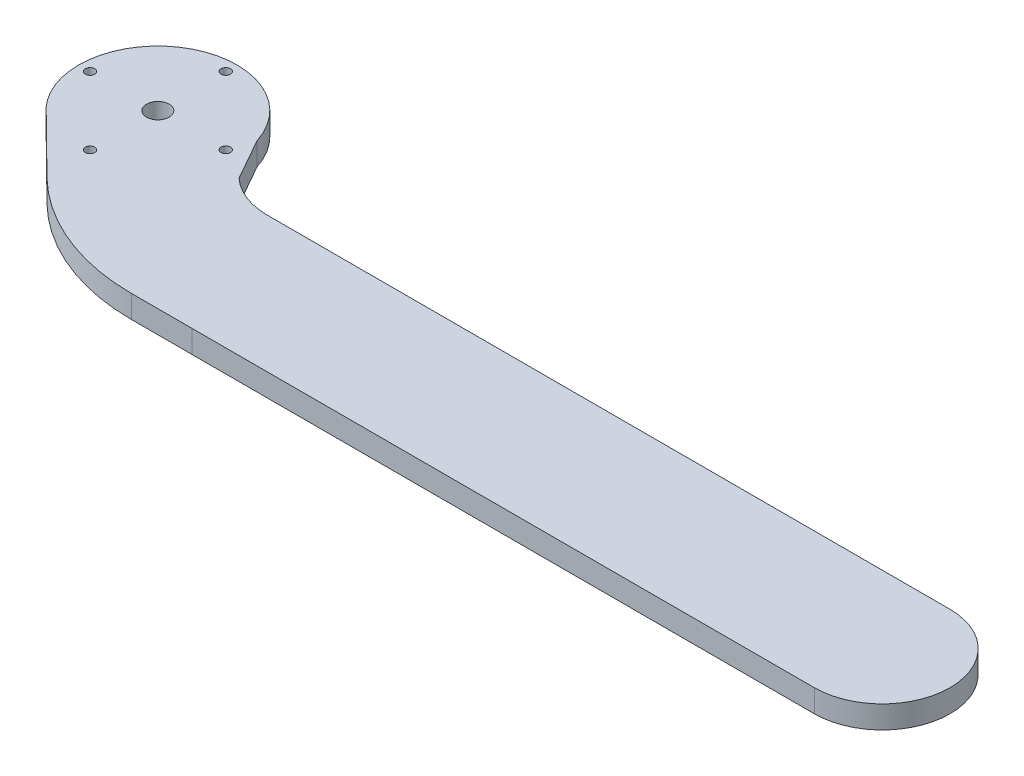
ISO-10303-21;
HEADER;
FILE_DESCRIPTION(('STEP AP214'),'2;1');
FILE_NAME('part.step','',(''),(''),'','','');
FILE_SCHEMA(('AUTOMOTIVE_DESIGN { 1 0 10303 214 1 1 1 1 }'));
ENDSEC;
DATA;
#1=APPLICATION_CONTEXT('core data for automotive mechanical design processes');
#2=APPLICATION_PROTOCOL_DEFINITION('international standard','automotive_design',2000,#1);
#3=PRODUCT_CONTEXT('',#1,'mechanical');
#4=PRODUCT('Part','Part','',(#3));
#5=PRODUCT_RELATED_PRODUCT_CATEGORY('part','',(#4));
#6=PRODUCT_DEFINITION_FORMATION('','',#4);
#7=PRODUCT_DEFINITION_CONTEXT('part definition',#1,'design');
#8=PRODUCT_DEFINITION('design','',#6,#7);
#9=PRODUCT_DEFINITION_SHAPE('','',#8);
#10=(LENGTH_UNIT() NAMED_UNIT(*) SI_UNIT(.MILLI.,.METRE.));
#11=(NAMED_UNIT(*) PLANE_ANGLE_UNIT() SI_UNIT($,.RADIAN.));
#12=(NAMED_UNIT(*) SI_UNIT($,.STERADIAN.) SOLID_ANGLE_UNIT());
#13=UNCERTAINTY_MEASURE_WITH_UNIT(LENGTH_MEASURE(1.E-05),#10,'distance_accuracy_value','');
#14=(GEOMETRIC_REPRESENTATION_CONTEXT(3) GLOBAL_UNCERTAINTY_ASSIGNED_CONTEXT((#13)) GLOBAL_UNIT_ASSIGNED_CONTEXT((#10,
#11,#12)) REPRESENTATION_CONTEXT('',''));
#15=CARTESIAN_POINT('',(0.,0.,0.));
#16=DIRECTION('',(0.,0.,1.));
#17=DIRECTION('',(1.,0.,0.));
#18=AXIS2_PLACEMENT_3D('',#15,#16,#17);
#19=CARTESIAN_POINT('',(-216.674785410447,10.,-94.1628705313177));
#20=DIRECTION('',(-0.000223300198745753,0.,-0.99999997506851));
#21=DIRECTION('',(-0.99999997506851,0.,0.000223300198745753));
#22=AXIS2_PLACEMENT_3D('',#19,#20,#21);
#23=PLANE('',#22);
#24=DIRECTION('',(0.99999997506851,0.,-0.000223300198745753));
#25=VECTOR('',#24,1.);
#26=CARTESIAN_POINT('',(-216.674785410447,0.,-94.1628705313177));
#27=LINE('',#26,#25);
#28=CARTESIAN_POINT('',(-224.228087349179,0.,-94.1611838774515));
#29=VERTEX_POINT('',#28);
#30=CARTESIAN_POINT('',(-216.674785410447,0.,-94.1628705313177));
#31=VERTEX_POINT('',#30);
#32=EDGE_CURVE('E149',#29,#31,#27,.T.);
#33=ORIENTED_EDGE('',*,*,#32,.T.);
#34=DIRECTION('',(0.,-1.,0.));
#35=VECTOR('',#34,1.);
#36=CARTESIAN_POINT('',(-216.674785410447,10.,-94.1628705313177));
#37=LINE('',#36,#35);
#38=CARTESIAN_POINT('',(-216.674785410447,10.,-94.1628705313177));
#39=VERTEX_POINT('',#38);
#40=EDGE_CURVE('E11',#39,#31,#37,.T.);
#41=ORIENTED_EDGE('',*,*,#40,.F.);
#42=DIRECTION('',(0.99999997506851,0.,-0.000223300198745753));
#43=VECTOR('',#42,1.);
#44=CARTESIAN_POINT('',(-216.674785410447,10.,-94.1628705313177));
#45=LINE('',#44,#43);
#46=CARTESIAN_POINT('',(-224.228087349179,10.,-94.1611838774515));
#47=VERTEX_POINT('',#46);
#48=EDGE_CURVE('E168',#47,#39,#45,.T.);
#49=ORIENTED_EDGE('',*,*,#48,.F.);
#50=DIRECTION('',(0.,-1.,0.));
#51=VECTOR('',#50,1.);
#52=CARTESIAN_POINT('',(-224.228087349179,10.,-94.1611838774515));
#53=LINE('',#52,#51);
#54=EDGE_CURVE('E145',#47,#29,#53,.T.);
#55=ORIENTED_EDGE('',*,*,#54,.T.);
#56=EDGE_LOOP('',(#33,#41,#49,#55));
#57=FACE_BOUND('',#56,.T.);
#58=ADVANCED_FACE('F41',(#57),#23,.F.);
#59=CARTESIAN_POINT('',(-216.672908110656,10.,-124.162870472581));
#60=DIRECTION('',(0.,-1.,0.));
#61=DIRECTION('',(0.,0.,-1.));
#62=AXIS2_PLACEMENT_3D('',#59,#60,#61);
#63=CYLINDRICAL_SURFACE('',#62,30.0000000000009);
#64=CARTESIAN_POINT('',(-216.672908110656,0.,-124.162870472581));
#65=DIRECTION('',(0.,-1.,0.));
#66=DIRECTION('',(0.,0.,1.));
#67=AXIS2_PLACEMENT_3D('',#64,#65,#66);
#68=CIRCLE('',#67,30.0000000000009);
#69=CARTESIAN_POINT('',(-236.884563066384,0.,-101.993319192714));
#70=VERTEX_POINT('',#69);
#71=EDGE_CURVE('E152',#31,#70,#68,.T.);
#72=ORIENTED_EDGE('',*,*,#71,.T.);
#73=DIRECTION('',(0.,-1.,0.));
#74=VECTOR('',#73,1.);
#75=CARTESIAN_POINT('',(-236.884563066384,10.,-101.993319192714));
#76=LINE('',#75,#74);
#77=CARTESIAN_POINT('',(-236.884563066384,10.,-101.993319192714));
#78=VERTEX_POINT('',#77);
#79=EDGE_CURVE('E49',#78,#70,#76,.T.);
#80=ORIENTED_EDGE('',*,*,#79,.F.);
#81=CARTESIAN_POINT('',(-216.672908110656,10.,-124.162870472581));
#82=DIRECTION('',(0.,-1.,0.));
#83=DIRECTION('',(0.,0.,1.));
#84=AXIS2_PLACEMENT_3D('',#81,#82,#83);
#85=CIRCLE('',#84,30.0000000000009);
#86=EDGE_CURVE('E106',#39,#78,#85,.T.);
#87=ORIENTED_EDGE('',*,*,#86,.F.);
#88=ORIENTED_EDGE('',*,*,#40,.T.);
#89=EDGE_LOOP('',(#72,#80,#87,#88));
#90=FACE_BOUND('',#89,.T.);
#91=ADVANCED_FACE('F272',(#90),#63,.F.);
#92=CARTESIAN_POINT('',(-236.884563066384,10.,-101.993319192714));
#93=DIRECTION('',(-0.870446546688982,0.,0.492262947373886));
#94=DIRECTION('',(0.492262947373886,0.,0.870446546688982));
#95=AXIS2_PLACEMENT_3D('',#92,#93,#94);
#96=PLANE('',#95);
#97=DIRECTION('',(-0.492262947373886,0.,-0.870446546688982));
#98=VECTOR('',#97,1.);
#99=CARTESIAN_POINT('',(-236.884563066384,0.,-101.993319192714));
#100=LINE('',#99,#98);
#101=CARTESIAN_POINT('',(-247.33378687914,0.,-120.470214177226));
#102=VERTEX_POINT('',#101);
#103=EDGE_CURVE('E155',#70,#102,#100,.T.);
#104=ORIENTED_EDGE('',*,*,#103,.T.);
#105=DIRECTION('',(0.,-1.,0.));
#106=VECTOR('',#105,1.);
#107=CARTESIAN_POINT('',(-247.33378687914,10.,-120.470214177226));
#108=LINE('',#107,#106);
#109=CARTESIAN_POINT('',(-247.33378687914,10.,-120.470214177226));
#110=VERTEX_POINT('',#109);
#111=EDGE_CURVE('E181',#110,#102,#108,.T.);
#112=ORIENTED_EDGE('',*,*,#111,.F.);
#113=DIRECTION('',(-0.492262947373886,0.,-0.870446546688982));
#114=VECTOR('',#113,1.);
#115=CARTESIAN_POINT('',(-236.884563066384,10.,-101.993319192714));
#116=LINE('',#115,#114);
#117=EDGE_CURVE('E189',#78,#110,#116,.T.);
#118=ORIENTED_EDGE('',*,*,#117,.F.);
#119=ORIENTED_EDGE('',*,*,#79,.T.);
#120=EDGE_LOOP('',(#104,#112,#118,#119));
#121=FACE_BOUND('',#120,.T.);
#122=ADVANCED_FACE('F187',(#121),#96,.F.);
#123=CARTESIAN_POINT('',(-280.722408110876,10.,-109.972596721648));
#124=DIRECTION('',(0.,-1.,0.));
#125=DIRECTION('',(0.,0.,-1.));
#126=AXIS2_PLACEMENT_3D('',#123,#124,#125);
#127=CYLINDRICAL_SURFACE('',#126,35.);
#128=CARTESIAN_POINT('',(-280.722408110876,0.,-109.972596721648));
#129=DIRECTION('',(0.,1.,0.));
#130=DIRECTION('',(0.,0.,1.));
#131=AXIS2_PLACEMENT_3D('',#128,#129,#130);
#132=CIRCLE('',#131,35.);
#133=CARTESIAN_POINT('',(-303.368494473778,0.,-83.2863685797023));
#134=VERTEX_POINT('',#133);
#135=EDGE_CURVE('E157',#102,#134,#132,.T.);
#136=ORIENTED_EDGE('',*,*,#135,.T.);
#137=DIRECTION('',(0.,-1.,0.));
#138=VECTOR('',#137,1.);
#139=CARTESIAN_POINT('',(-303.368494473778,10.,-83.2863685797023));
#140=LINE('',#139,#138);
#141=CARTESIAN_POINT('',(-303.368494473778,10.,-83.2863685797023));
#142=VERTEX_POINT('',#141);
#143=EDGE_CURVE('E178',#142,#134,#140,.T.);
#144=ORIENTED_EDGE('',*,*,#143,.F.);
#145=CARTESIAN_POINT('',(-280.722408110876,10.,-109.972596721648));
#146=DIRECTION('',(0.,1.,0.));
#147=DIRECTION('',(0.,0.,1.));
#148=AXIS2_PLACEMENT_3D('',#145,#146,#147);
#149=CIRCLE('',#148,35.);
#150=EDGE_CURVE('E207',#110,#142,#149,.T.);
#151=ORIENTED_EDGE('',*,*,#150,.F.);
#152=ORIENTED_EDGE('',*,*,#111,.T.);
#153=EDGE_LOOP('',(#136,#144,#151,#152));
#154=FACE_BOUND('',#153,.T.);
#155=ADVANCED_FACE('F198',(#154),#127,.T.);
#156=CARTESIAN_POINT('',(-279.331674577977,10.,-59.5573058144673));
#157=DIRECTION('',(0.702536287344737,0.,-0.711647922054068));
#158=DIRECTION('',(-0.711647922054068,0.,-0.702536287344737));
#159=AXIS2_PLACEMENT_3D('',#156,#157,#158);
#160=PLANE('',#159);
#161=DIRECTION('',(0.711647922054068,0.,0.702536287344737));
#162=VECTOR('',#161,1.);
#163=CARTESIAN_POINT('',(-279.331674577977,0.,-59.5573058144673));
#164=LINE('',#163,#162);
#165=CARTESIAN_POINT('',(-279.331674577977,0.,-59.5573058144672));
#166=VERTEX_POINT('',#165);
#167=EDGE_CURVE('E159',#134,#166,#164,.T.);
#168=ORIENTED_EDGE('',*,*,#167,.T.);
#169=DIRECTION('',(0.,-1.,0.));
#170=VECTOR('',#169,1.);
#171=CARTESIAN_POINT('',(-279.331674577977,10.,-59.5573058144672));
#172=LINE('',#171,#170);
#173=CARTESIAN_POINT('',(-279.331674577977,10.,-59.5573058144672));
#174=VERTEX_POINT('',#173);
#175=EDGE_CURVE('E175',#174,#166,#172,.T.);
#176=ORIENTED_EDGE('',*,*,#175,.F.);
#177=DIRECTION('',(0.711647922054068,0.,0.702536287344737));
#178=VECTOR('',#177,1.);
#179=CARTESIAN_POINT('',(-279.331674577977,10.,-59.5573058144673));
#180=LINE('',#179,#178);
#181=EDGE_CURVE('E204',#142,#174,#180,.T.);
#182=ORIENTED_EDGE('',*,*,#181,.F.);
#183=ORIENTED_EDGE('',*,*,#143,.T.);
#184=EDGE_LOOP('',(#168,#176,#182,#183));
#185=FACE_BOUND('',#184,.T.);
#186=ADVANCED_FACE('F202',(#185),#160,.F.);
#187=CARTESIAN_POINT('',(-216.672908110656,10.,-124.162870472581));
#188=DIRECTION('',(0.,-1.,0.));
#189=DIRECTION('',(0.,0.,-1.));
#190=AXIS2_PLACEMENT_3D('',#187,#188,#189);
#191=CYLINDRICAL_SURFACE('',#190,90.0000000000001);
#192=CARTESIAN_POINT('',(-216.672908110656,0.,-124.162870472581));
#193=DIRECTION('',(0.,1.,0.));
#194=DIRECTION('',(0.,0.,1.));
#195=AXIS2_PLACEMENT_3D('',#192,#193,#194);
#196=CIRCLE('',#195,90.0000000000001);
#197=CARTESIAN_POINT('',(-216.678540206167,0.,-34.1628706488059));
#198=VERTEX_POINT('',#197);
#199=EDGE_CURVE('E161',#166,#198,#196,.T.);
#200=ORIENTED_EDGE('',*,*,#199,.T.);
#201=DIRECTION('',(0.,-1.,0.));
#202=VECTOR('',#201,1.);
#203=CARTESIAN_POINT('',(-216.678540206167,10.,-34.1628706488059));
#204=LINE('',#203,#202);
#205=CARTESIAN_POINT('',(-216.678540206167,10.,-34.1628706488059));
#206=VERTEX_POINT('',#205);
#207=EDGE_CURVE('E172',#206,#198,#204,.T.);
#208=ORIENTED_EDGE('',*,*,#207,.F.);
#209=CARTESIAN_POINT('',(-216.672908110656,10.,-124.162870472581));
#210=DIRECTION('',(0.,1.,0.));
#211=DIRECTION('',(0.,0.,1.));
#212=AXIS2_PLACEMENT_3D('',#209,#210,#211);
#213=CIRCLE('',#212,90.0000000000001);
#214=EDGE_CURVE('E206',#174,#206,#213,.T.);
#215=ORIENTED_EDGE('',*,*,#214,.F.);
#216=ORIENTED_EDGE('',*,*,#175,.T.);
#217=EDGE_LOOP('',(#200,#208,#215,#216));
#218=FACE_BOUND('',#217,.T.);
#219=ADVANCED_FACE('F284',(#218),#191,.T.);
#220=CARTESIAN_POINT('',(-216.678540206167,10.,-34.1628706488059));
#221=DIRECTION('',(6.25788390120463E-05,0.,-0.999999998041944));
#222=DIRECTION('',(-0.999999998041945,0.,-6.25788390120464E-05));
#223=AXIS2_PLACEMENT_3D('',#220,#221,#222);
#224=PLANE('',#223);
#225=DIRECTION('',(0.999999998041944,0.,6.25788390120463E-05));
#226=VECTOR('',#225,1.);
#227=CARTESIAN_POINT('',(-216.678540206167,0.,-34.1628706488059));
#228=LINE('',#227,#226);
#229=CARTESIAN_POINT('',(-189.724199445738,0.,-34.1611838774515));
#230=VERTEX_POINT('',#229);
#231=EDGE_CURVE('E163',#198,#230,#228,.T.);
#232=ORIENTED_EDGE('',*,*,#231,.T.);
#233=DIRECTION('',(0.,-1.,0.));
#234=VECTOR('',#233,1.);
#235=CARTESIAN_POINT('',(-189.724199445738,10.,-34.1611838774515));
#236=LINE('',#235,#234);
#237=CARTESIAN_POINT('',(-189.724199445738,10.,-34.1611838774515));
#238=VERTEX_POINT('',#237);
#239=EDGE_CURVE('E140',#238,#230,#236,.T.);
#240=ORIENTED_EDGE('',*,*,#239,.F.);
#241=DIRECTION('',(0.999999998041944,0.,6.25788390120463E-05));
#242=VECTOR('',#241,1.);
#243=CARTESIAN_POINT('',(-216.678540206167,10.,-34.1628706488059));
#244=LINE('',#243,#242);
#245=EDGE_CURVE('E131',#206,#238,#244,.T.);
#246=ORIENTED_EDGE('',*,*,#245,.F.);
#247=ORIENTED_EDGE('',*,*,#207,.T.);
#248=EDGE_LOOP('',(#232,#240,#246,#247));
#249=FACE_BOUND('',#248,.T.);
#250=ADVANCED_FACE('F281',(#249),#224,.F.);
#251=CARTESIAN_POINT('',(85.2758005542617,10.,-34.1611838774516));
#252=DIRECTION('',(0.,0.,-1.));
#253=DIRECTION('',(-1.,0.,0.));
#254=AXIS2_PLACEMENT_3D('',#251,#252,#253);
#255=PLANE('',#254);
#256=DIRECTION('',(1.,0.,0.));
#257=VECTOR('',#256,1.);
#258=CARTESIAN_POINT('',(85.2758005542617,0.,-34.1611838774516));
#259=LINE('',#258,#257);
#260=CARTESIAN_POINT('',(85.2758005542617,0.,-34.1611838774516));
#261=VERTEX_POINT('',#260);
#262=EDGE_CURVE('E139',#230,#261,#259,.T.);
#263=ORIENTED_EDGE('',*,*,#262,.T.);
#264=DIRECTION('',(0.,-1.,0.));
#265=VECTOR('',#264,1.);
#266=CARTESIAN_POINT('',(85.2758005542617,10.,-34.1611838774516));
#267=LINE('',#266,#265);
#268=CARTESIAN_POINT('',(85.2758005542617,10.,-34.1611838774516));
#269=VERTEX_POINT('',#268);
#270=EDGE_CURVE('E136',#269,#261,#267,.T.);
#271=ORIENTED_EDGE('',*,*,#270,.F.);
#272=DIRECTION('',(1.,0.,0.));
#273=VECTOR('',#272,1.);
#274=CARTESIAN_POINT('',(85.2758005542617,10.,-34.1611838774516));
#275=LINE('',#274,#273);
#276=EDGE_CURVE('E125',#238,#269,#275,.T.);
#277=ORIENTED_EDGE('',*,*,#276,.F.);
#278=ORIENTED_EDGE('',*,*,#239,.T.);
#279=EDGE_LOOP('',(#263,#271,#277,#278));
#280=FACE_BOUND('',#279,.T.);
#281=ADVANCED_FACE('F137',(#280),#255,.F.);
#282=CARTESIAN_POINT('',(85.2758005542617,10.,-64.1611838774515));
#283=DIRECTION('',(0.,-1.,0.));
#284=DIRECTION('',(0.,0.,-1.));
#285=AXIS2_PLACEMENT_3D('',#282,#283,#284);
#286=CYLINDRICAL_SURFACE('',#285,30.);
#287=CARTESIAN_POINT('',(85.2758005542617,0.,-64.1611838774515));
#288=DIRECTION('',(0.,1.,0.));
#289=DIRECTION('',(0.,0.,1.));
#290=AXIS2_PLACEMENT_3D('',#287,#288,#289);
#291=CIRCLE('',#290,30.);
#292=CARTESIAN_POINT('',(85.2758005542617,0.,-94.1611838774515));
#293=VERTEX_POINT('',#292);
#294=EDGE_CURVE('E92',#261,#293,#291,.T.);
#295=ORIENTED_EDGE('',*,*,#294,.T.);
#296=DIRECTION('',(0.,-1.,0.));
#297=VECTOR('',#296,1.);
#298=CARTESIAN_POINT('',(85.2758005542617,10.,-94.1611838774515));
#299=LINE('',#298,#297);
#300=CARTESIAN_POINT('',(85.2758005542617,10.,-94.1611838774515));
#301=VERTEX_POINT('',#300);
#302=EDGE_CURVE('E141',#301,#293,#299,.T.);
#303=ORIENTED_EDGE('',*,*,#302,.F.);
#304=CARTESIAN_POINT('',(85.2758005542617,10.,-64.1611838774515));
#305=DIRECTION('',(0.,1.,0.));
#306=DIRECTION('',(0.,0.,1.));
#307=AXIS2_PLACEMENT_3D('',#304,#305,#306);
#308=CIRCLE('',#307,30.);
#309=EDGE_CURVE('E129',#269,#301,#308,.T.);
#310=ORIENTED_EDGE('',*,*,#309,.F.);
#311=ORIENTED_EDGE('',*,*,#270,.T.);
#312=EDGE_LOOP('',(#295,#303,#310,#311));
#313=FACE_BOUND('',#312,.T.);
#314=ADVANCED_FACE('F143',(#313),#286,.T.);
#315=CARTESIAN_POINT('',(-224.228087349179,10.,-94.1611838774515));
#316=DIRECTION('',(0.,0.,1.));
#317=DIRECTION('',(1.,0.,0.));
#318=AXIS2_PLACEMENT_3D('',#315,#316,#317);
#319=PLANE('',#318);
#320=DIRECTION('',(-1.,0.,0.));
#321=VECTOR('',#320,1.);
#322=CARTESIAN_POINT('',(-224.228087349179,0.,-94.1611838774515));
#323=LINE('',#322,#321);
#324=EDGE_CURVE('E98',#293,#29,#323,.T.);
#325=ORIENTED_EDGE('',*,*,#324,.T.);
#326=ORIENTED_EDGE('',*,*,#54,.F.);
#327=DIRECTION('',(-1.,0.,0.));
#328=VECTOR('',#327,1.);
#329=CARTESIAN_POINT('',(-224.228087349179,10.,-94.1611838774515));
#330=LINE('',#329,#328);
#331=EDGE_CURVE('E57',#301,#47,#330,.T.);
#332=ORIENTED_EDGE('',*,*,#331,.F.);
#333=ORIENTED_EDGE('',*,*,#302,.T.);
#334=EDGE_LOOP('',(#325,#326,#332,#333));
#335=FACE_BOUND('',#334,.T.);
#336=ADVANCED_FACE('F249',(#335),#319,.F.);
#337=CARTESIAN_POINT('',(85.2758005542617,10.,-64.1611838774515));
#338=DIRECTION('',(0.,1.,0.));
#339=DIRECTION('',(0.,0.,1.));
#340=AXIS2_PLACEMENT_3D('',#337,#338,#339);
#341=PLANE('',#340);
#342=CARTESIAN_POINT('',(-280.722408110876,10.,-139.972596721648));
#343=DIRECTION('',(0.,1.,0.));
#344=DIRECTION('',(0.,0.,1.));
#345=AXIS2_PLACEMENT_3D('',#342,#343,#344);
#346=CIRCLE('',#345,2.09999999999999);
#347=CARTESIAN_POINT('',(-280.722408110876,10.,-137.872596721648));
#348=VERTEX_POINT('',#347);
#349=EDGE_CURVE('E218',#348,#348,#346,.T.);
#350=ORIENTED_EDGE('',*,*,#349,.F.);
#351=EDGE_LOOP('',(#350));
#352=FACE_BOUND('',#351,.T.);
#353=CARTESIAN_POINT('',(-310.722408110876,10.,-109.972596721648));
#354=DIRECTION('',(0.,1.,0.));
#355=DIRECTION('',(0.,0.,1.));
#356=AXIS2_PLACEMENT_3D('',#353,#354,#355);
#357=CIRCLE('',#356,2.09999999999993);
#358=CARTESIAN_POINT('',(-310.722408110876,10.,-107.872596721648));
#359=VERTEX_POINT('',#358);
#360=EDGE_CURVE('E224',#359,#359,#357,.T.);
#361=ORIENTED_EDGE('',*,*,#360,.F.);
#362=EDGE_LOOP('',(#361));
#363=FACE_BOUND('',#362,.T.);
#364=CARTESIAN_POINT('',(-280.722408110876,10.,-79.9725967216482));
#365=DIRECTION('',(0.,1.,0.));
#366=DIRECTION('',(0.,0.,1.));
#367=AXIS2_PLACEMENT_3D('',#364,#365,#366);
#368=CIRCLE('',#367,2.09999999999999);
#369=CARTESIAN_POINT('',(-280.722408110876,10.,-77.8725967216482));
#370=VERTEX_POINT('',#369);
#371=EDGE_CURVE('E225',#370,#370,#368,.T.);
#372=ORIENTED_EDGE('',*,*,#371,.F.);
#373=EDGE_LOOP('',(#372));
#374=FACE_BOUND('',#373,.T.);
#375=CARTESIAN_POINT('',(-250.722408110876,10.,-109.972596721649));
#376=DIRECTION('',(0.,1.,0.));
#377=DIRECTION('',(0.,0.,1.));
#378=AXIS2_PLACEMENT_3D('',#375,#376,#377);
#379=CIRCLE('',#378,2.09999999999993);
#380=CARTESIAN_POINT('',(-250.722408110876,10.,-107.872596721649));
#381=VERTEX_POINT('',#380);
#382=EDGE_CURVE('E236',#381,#381,#379,.T.);
#383=ORIENTED_EDGE('',*,*,#382,.F.);
#384=EDGE_LOOP('',(#383));
#385=FACE_BOUND('',#384,.T.);
#386=CARTESIAN_POINT('',(-280.722408110876,10.,-109.972596721648));
#387=DIRECTION('',(0.,1.,0.));
#388=DIRECTION('',(0.,0.,1.));
#389=AXIS2_PLACEMENT_3D('',#386,#387,#388);
#390=CIRCLE('',#389,4.99999999999999);
#391=CARTESIAN_POINT('',(-280.722408110876,10.,-104.972596721648));
#392=VERTEX_POINT('',#391);
#393=EDGE_CURVE('E215',#392,#392,#390,.T.);
#394=ORIENTED_EDGE('',*,*,#393,.F.);
#395=EDGE_LOOP('',(#394));
#396=FACE_BOUND('',#395,.T.);
#397=ORIENTED_EDGE('',*,*,#48,.T.);
#398=ORIENTED_EDGE('',*,*,#86,.T.);
#399=ORIENTED_EDGE('',*,*,#117,.T.);
#400=ORIENTED_EDGE('',*,*,#150,.T.);
#401=ORIENTED_EDGE('',*,*,#181,.T.);
#402=ORIENTED_EDGE('',*,*,#214,.T.);
#403=ORIENTED_EDGE('',*,*,#245,.T.);
#404=ORIENTED_EDGE('',*,*,#276,.T.);
#405=ORIENTED_EDGE('',*,*,#309,.T.);
#406=ORIENTED_EDGE('',*,*,#331,.T.);
#407=EDGE_LOOP('',(#397,#398,#399,#400,#401,#402,#403,#404,#405,#406));
#408=FACE_BOUND('',#407,.T.);
#409=ADVANCED_FACE('F127',(#352,#363,#374,#385,#396,#408),#341,.T.);
#410=CARTESIAN_POINT('',(85.2758005542617,0.,-64.1611838774515));
#411=DIRECTION('',(0.,1.,0.));
#412=DIRECTION('',(0.,0.,1.));
#413=AXIS2_PLACEMENT_3D('',#410,#411,#412);
#414=PLANE('',#413);
#415=CARTESIAN_POINT('',(-280.722408110876,0.,-139.972596721648));
#416=DIRECTION('',(0.,1.,0.));
#417=DIRECTION('',(0.,0.,1.));
#418=AXIS2_PLACEMENT_3D('',#415,#416,#417);
#419=CIRCLE('',#418,2.09999999999999);
#420=CARTESIAN_POINT('',(-280.722408110876,0.,-137.872596721648));
#421=VERTEX_POINT('',#420);
#422=EDGE_CURVE('E228',#421,#421,#419,.T.);
#423=ORIENTED_EDGE('',*,*,#422,.T.);
#424=EDGE_LOOP('',(#423));
#425=FACE_BOUND('',#424,.T.);
#426=CARTESIAN_POINT('',(-310.722408110876,0.,-109.972596721648));
#427=DIRECTION('',(0.,1.,0.));
#428=DIRECTION('',(0.,0.,1.));
#429=AXIS2_PLACEMENT_3D('',#426,#427,#428);
#430=CIRCLE('',#429,2.09999999999993);
#431=CARTESIAN_POINT('',(-310.722408110876,0.,-107.872596721648));
#432=VERTEX_POINT('',#431);
#433=EDGE_CURVE('E221',#432,#432,#430,.T.);
#434=ORIENTED_EDGE('',*,*,#433,.T.);
#435=EDGE_LOOP('',(#434));
#436=FACE_BOUND('',#435,.T.);
#437=CARTESIAN_POINT('',(-280.722408110876,0.,-79.9725967216482));
#438=DIRECTION('',(0.,1.,0.));
#439=DIRECTION('',(0.,0.,1.));
#440=AXIS2_PLACEMENT_3D('',#437,#438,#439);
#441=CIRCLE('',#440,2.09999999999999);
#442=CARTESIAN_POINT('',(-280.722408110876,0.,-77.8725967216482));
#443=VERTEX_POINT('',#442);
#444=EDGE_CURVE('E239',#443,#443,#441,.T.);
#445=ORIENTED_EDGE('',*,*,#444,.T.);
#446=EDGE_LOOP('',(#445));
#447=FACE_BOUND('',#446,.T.);
#448=CARTESIAN_POINT('',(-250.722408110876,0.,-109.972596721649));
#449=DIRECTION('',(0.,1.,0.));
#450=DIRECTION('',(0.,0.,1.));
#451=AXIS2_PLACEMENT_3D('',#448,#449,#450);
#452=CIRCLE('',#451,2.09999999999993);
#453=CARTESIAN_POINT('',(-250.722408110876,0.,-107.872596721649));
#454=VERTEX_POINT('',#453);
#455=EDGE_CURVE('E233',#454,#454,#452,.T.);
#456=ORIENTED_EDGE('',*,*,#455,.T.);
#457=EDGE_LOOP('',(#456));
#458=FACE_BOUND('',#457,.T.);
#459=CARTESIAN_POINT('',(-280.722408110876,0.,-109.972596721648));
#460=DIRECTION('',(0.,1.,0.));
#461=DIRECTION('',(0.,0.,1.));
#462=AXIS2_PLACEMENT_3D('',#459,#460,#461);
#463=CIRCLE('',#462,4.99999999999999);
#464=CARTESIAN_POINT('',(-280.722408110876,0.,-104.972596721648));
#465=VERTEX_POINT('',#464);
#466=EDGE_CURVE('E153',#465,#465,#463,.T.);
#467=ORIENTED_EDGE('',*,*,#466,.T.);
#468=EDGE_LOOP('',(#467));
#469=FACE_BOUND('',#468,.T.);
#470=ORIENTED_EDGE('',*,*,#32,.F.);
#471=ORIENTED_EDGE('',*,*,#324,.F.);
#472=ORIENTED_EDGE('',*,*,#294,.F.);
#473=ORIENTED_EDGE('',*,*,#262,.F.);
#474=ORIENTED_EDGE('',*,*,#231,.F.);
#475=ORIENTED_EDGE('',*,*,#199,.F.);
#476=ORIENTED_EDGE('',*,*,#167,.F.);
#477=ORIENTED_EDGE('',*,*,#135,.F.);
#478=ORIENTED_EDGE('',*,*,#103,.F.);
#479=ORIENTED_EDGE('',*,*,#71,.F.);
#480=EDGE_LOOP('',(#470,#471,#472,#473,#474,#475,#476,#477,#478,#479));
#481=FACE_BOUND('',#480,.T.);
#482=ADVANCED_FACE('F193',(#425,#436,#447,#458,#469,#481),#414,.F.);
#483=CARTESIAN_POINT('',(-280.722408110876,0.,-109.972596721648));
#484=DIRECTION('',(0.,1.,0.));
#485=DIRECTION('',(0.,0.,1.));
#486=AXIS2_PLACEMENT_3D('',#483,#484,#485);
#487=CYLINDRICAL_SURFACE('',#486,4.99999999999999);
#488=ORIENTED_EDGE('',*,*,#466,.F.);
#489=EDGE_LOOP('',(#488));
#490=FACE_BOUND('',#489,.T.);
#491=ORIENTED_EDGE('',*,*,#393,.T.);
#492=EDGE_LOOP('',(#491));
#493=FACE_BOUND('',#492,.T.);
#494=ADVANCED_FACE('F256',(#490,#493),#487,.F.);
#495=CARTESIAN_POINT('',(-250.722408110876,0.,-109.972596721649));
#496=DIRECTION('',(0.,1.,0.));
#497=DIRECTION('',(0.,0.,1.));
#498=AXIS2_PLACEMENT_3D('',#495,#496,#497);
#499=CYLINDRICAL_SURFACE('',#498,2.09999999999993);
#500=ORIENTED_EDGE('',*,*,#455,.F.);
#501=EDGE_LOOP('',(#500));
#502=FACE_BOUND('',#501,.T.);
#503=ORIENTED_EDGE('',*,*,#382,.T.);
#504=EDGE_LOOP('',(#503));
#505=FACE_BOUND('',#504,.T.);
#506=ADVANCED_FACE('F258',(#502,#505),#499,.F.);
#507=CARTESIAN_POINT('',(-280.722408110876,0.,-79.9725967216482));
#508=DIRECTION('',(0.,1.,0.));
#509=DIRECTION('',(0.,0.,1.));
#510=AXIS2_PLACEMENT_3D('',#507,#508,#509);
#511=CYLINDRICAL_SURFACE('',#510,2.09999999999999);
#512=ORIENTED_EDGE('',*,*,#444,.F.);
#513=EDGE_LOOP('',(#512));
#514=FACE_BOUND('',#513,.T.);
#515=ORIENTED_EDGE('',*,*,#371,.T.);
#516=EDGE_LOOP('',(#515));
#517=FACE_BOUND('',#516,.T.);
#518=ADVANCED_FACE('F245',(#514,#517),#511,.F.);
#519=CARTESIAN_POINT('',(-310.722408110876,0.,-109.972596721648));
#520=DIRECTION('',(0.,1.,0.));
#521=DIRECTION('',(0.,0.,1.));
#522=AXIS2_PLACEMENT_3D('',#519,#520,#521);
#523=CYLINDRICAL_SURFACE('',#522,2.09999999999993);
#524=ORIENTED_EDGE('',*,*,#433,.F.);
#525=EDGE_LOOP('',(#524));
#526=FACE_BOUND('',#525,.T.);
#527=ORIENTED_EDGE('',*,*,#360,.T.);
#528=EDGE_LOOP('',(#527));
#529=FACE_BOUND('',#528,.T.);
#530=ADVANCED_FACE('F384',(#526,#529),#523,.F.);
#531=CARTESIAN_POINT('',(-280.722408110876,0.,-139.972596721648));
#532=DIRECTION('',(0.,1.,0.));
#533=DIRECTION('',(0.,0.,1.));
#534=AXIS2_PLACEMENT_3D('',#531,#532,#533);
#535=CYLINDRICAL_SURFACE('',#534,2.09999999999999);
#536=ORIENTED_EDGE('',*,*,#422,.F.);
#537=EDGE_LOOP('',(#536));
#538=FACE_BOUND('',#537,.T.);
#539=ORIENTED_EDGE('',*,*,#349,.T.);
#540=EDGE_LOOP('',(#539));
#541=FACE_BOUND('',#540,.T.);
#542=ADVANCED_FACE('F395',(#538,#541),#535,.F.);
#543=CLOSED_SHELL('',(#58,#91,#122,#155,#186,#219,#250,#281,#314,#336,#409,#482,#494,#506,#518,
#530,#542));
#544=MANIFOLD_SOLID_BREP('B2',#543);
#545=ADVANCED_BREP_SHAPE_REPRESENTATION('',(#18,#544),#14);
#546=SHAPE_DEFINITION_REPRESENTATION(#9,#545);
ENDSEC;
END-ISO-10303-21;
